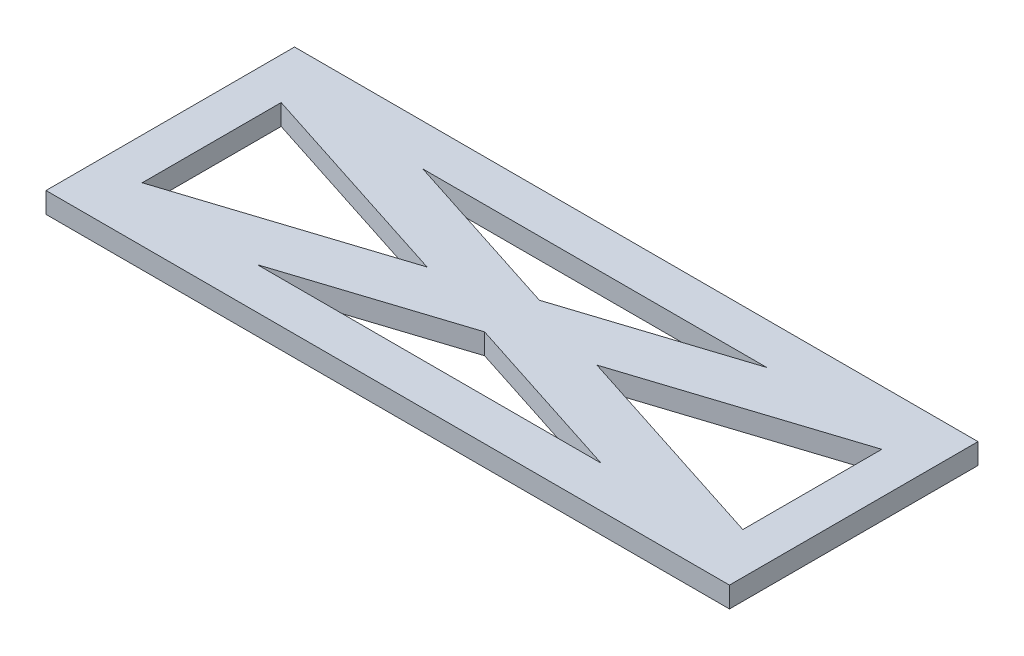
ISO-10303-21;
HEADER;
FILE_DESCRIPTION(('STEP AP214'),'2;1');
FILE_NAME('part.step','',(''),(''),'','','');
FILE_SCHEMA(('AUTOMOTIVE_DESIGN { 1 0 10303 214 1 1 1 1 }'));
ENDSEC;
DATA;
#1=APPLICATION_CONTEXT('core data for automotive mechanical design processes');
#2=APPLICATION_PROTOCOL_DEFINITION('international standard','automotive_design',2000,#1);
#3=PRODUCT_CONTEXT('',#1,'mechanical');
#4=PRODUCT('Part','Part','',(#3));
#5=PRODUCT_RELATED_PRODUCT_CATEGORY('part','',(#4));
#6=PRODUCT_DEFINITION_FORMATION('','',#4);
#7=PRODUCT_DEFINITION_CONTEXT('part definition',#1,'design');
#8=PRODUCT_DEFINITION('design','',#6,#7);
#9=PRODUCT_DEFINITION_SHAPE('','',#8);
#10=(LENGTH_UNIT() NAMED_UNIT(*) SI_UNIT(.MILLI.,.METRE.));
#11=(NAMED_UNIT(*) PLANE_ANGLE_UNIT() SI_UNIT($,.RADIAN.));
#12=(NAMED_UNIT(*) SI_UNIT($,.STERADIAN.) SOLID_ANGLE_UNIT());
#13=UNCERTAINTY_MEASURE_WITH_UNIT(LENGTH_MEASURE(1.E-05),#10,'distance_accuracy_value','');
#14=(GEOMETRIC_REPRESENTATION_CONTEXT(3) GLOBAL_UNCERTAINTY_ASSIGNED_CONTEXT((#13)) GLOBAL_UNIT_ASSIGNED_CONTEXT((#10,
#11,#12)) REPRESENTATION_CONTEXT('',''));
#15=CARTESIAN_POINT('',(0.,0.,0.));
#16=DIRECTION('',(0.,0.,1.));
#17=DIRECTION('',(1.,0.,0.));
#18=AXIS2_PLACEMENT_3D('',#15,#16,#17);
#19=CARTESIAN_POINT('',(1.93213949104616,5.,5.98963242224309));
#20=DIRECTION('',(0.307002779922758,0.,0.951708617760551));
#21=DIRECTION('',(0.951708617760551,0.,-0.307002779922758));
#22=AXIS2_PLACEMENT_3D('',#19,#20,#21);
#23=PLANE('',#22);
#24=DIRECTION('',(-0.951708617760551,0.,0.307002779922758));
#25=VECTOR('',#24,1.);
#26=CARTESIAN_POINT('',(1.93213949104616,0.,5.98963242224309));
#27=LINE('',#26,#25);
#28=CARTESIAN_POINT('',(72.5,0.,-16.7741935483872));
#29=VERTEX_POINT('',#28);
#30=CARTESIAN_POINT('',(20.4999999999998,0.,0.));
#31=VERTEX_POINT('',#30);
#32=EDGE_CURVE('E164',#29,#31,#27,.T.);
#33=ORIENTED_EDGE('',*,*,#32,.F.);
#34=DIRECTION('',(0.,-1.,0.));
#35=VECTOR('',#34,1.);
#36=CARTESIAN_POINT('',(72.5,5.,-16.7741935483872));
#37=LINE('',#36,#35);
#38=CARTESIAN_POINT('',(72.5,5.,-16.7741935483872));
#39=VERTEX_POINT('',#38);
#40=EDGE_CURVE('E11',#39,#29,#37,.T.);
#41=ORIENTED_EDGE('',*,*,#40,.F.);
#42=DIRECTION('',(-0.951708617760551,0.,0.307002779922758));
#43=VECTOR('',#42,1.);
#44=CARTESIAN_POINT('',(1.93213949104616,5.,5.98963242224309));
#45=LINE('',#44,#43);
#46=CARTESIAN_POINT('',(20.4999999999998,5.,0.));
#47=VERTEX_POINT('',#46);
#48=EDGE_CURVE('E163',#39,#47,#45,.T.);
#49=ORIENTED_EDGE('',*,*,#48,.T.);
#50=DIRECTION('',(0.,-1.,0.));
#51=VECTOR('',#50,1.);
#52=CARTESIAN_POINT('',(20.4999999999998,5.,0.));
#53=LINE('',#52,#51);
#54=EDGE_CURVE('E118',#47,#31,#53,.T.);
#55=ORIENTED_EDGE('',*,*,#54,.T.);
#56=EDGE_LOOP('',(#33,#41,#49,#55));
#57=FACE_BOUND('',#56,.T.);
#58=ADVANCED_FACE('F40',(#57),#23,.T.);
#59=CARTESIAN_POINT('',(72.5,5.,0.));
#60=DIRECTION('',(1.,0.,0.));
#61=DIRECTION('',(0.,0.,-1.));
#62=AXIS2_PLACEMENT_3D('',#59,#60,#61);
#63=PLANE('',#62);
#64=DIRECTION('',(0.,0.,1.));
#65=VECTOR('',#64,1.);
#66=CARTESIAN_POINT('',(72.5,0.,0.));
#67=LINE('',#66,#65);
#68=CARTESIAN_POINT('',(72.5,0.,16.7741935483871));
#69=VERTEX_POINT('',#68);
#70=EDGE_CURVE('E217',#29,#69,#67,.T.);
#71=ORIENTED_EDGE('',*,*,#70,.T.);
#72=DIRECTION('',(0.,-1.,0.));
#73=VECTOR('',#72,1.);
#74=CARTESIAN_POINT('',(72.5,5.,16.7741935483871));
#75=LINE('',#74,#73);
#76=CARTESIAN_POINT('',(72.5,5.,16.7741935483871));
#77=VERTEX_POINT('',#76);
#78=EDGE_CURVE('E50',#77,#69,#75,.T.);
#79=ORIENTED_EDGE('',*,*,#78,.F.);
#80=DIRECTION('',(0.,0.,1.));
#81=VECTOR('',#80,1.);
#82=CARTESIAN_POINT('',(72.5,5.,0.));
#83=LINE('',#82,#81);
#84=EDGE_CURVE('E168',#39,#77,#83,.T.);
#85=ORIENTED_EDGE('',*,*,#84,.F.);
#86=ORIENTED_EDGE('',*,*,#40,.T.);
#87=EDGE_LOOP('',(#71,#79,#85,#86));
#88=FACE_BOUND('',#87,.T.);
#89=ADVANCED_FACE('F169',(#88),#63,.F.);
#90=CARTESIAN_POINT('',(82.5,5.,0.));
#91=DIRECTION('',(-1.,0.,0.));
#92=DIRECTION('',(0.,0.,1.));
#93=AXIS2_PLACEMENT_3D('',#90,#91,#92);
#94=PLANE('',#93);
#95=DIRECTION('',(0.,0.,-1.));
#96=VECTOR('',#95,1.);
#97=CARTESIAN_POINT('',(82.5,0.,0.));
#98=LINE('',#97,#96);
#99=CARTESIAN_POINT('',(82.5,0.,30.));
#100=VERTEX_POINT('',#99);
#101=CARTESIAN_POINT('',(82.5,0.,-30.));
#102=VERTEX_POINT('',#101);
#103=EDGE_CURVE('E207',#100,#102,#98,.T.);
#104=ORIENTED_EDGE('',*,*,#103,.T.);
#105=DIRECTION('',(0.,-1.,0.));
#106=VECTOR('',#105,1.);
#107=CARTESIAN_POINT('',(82.5,5.,-30.));
#108=LINE('',#107,#106);
#109=CARTESIAN_POINT('',(82.5,5.,-30.));
#110=VERTEX_POINT('',#109);
#111=EDGE_CURVE('E222',#110,#102,#108,.T.);
#112=ORIENTED_EDGE('',*,*,#111,.F.);
#113=DIRECTION('',(0.,0.,-1.));
#114=VECTOR('',#113,1.);
#115=CARTESIAN_POINT('',(82.5,5.,0.));
#116=LINE('',#115,#114);
#117=CARTESIAN_POINT('',(82.5,5.,30.));
#118=VERTEX_POINT('',#117);
#119=EDGE_CURVE('E286',#118,#110,#116,.T.);
#120=ORIENTED_EDGE('',*,*,#119,.F.);
#121=DIRECTION('',(0.,-1.,0.));
#122=VECTOR('',#121,1.);
#123=CARTESIAN_POINT('',(82.5,5.,30.));
#124=LINE('',#123,#122);
#125=EDGE_CURVE('E224',#118,#100,#124,.T.);
#126=ORIENTED_EDGE('',*,*,#125,.T.);
#127=EDGE_LOOP('',(#104,#112,#120,#126));
#128=FACE_BOUND('',#127,.T.);
#129=ADVANCED_FACE('F306',(#128),#94,.F.);
#130=CARTESIAN_POINT('',(0.,5.,-30.));
#131=DIRECTION('',(0.,0.,1.));
#132=DIRECTION('',(1.,0.,0.));
#133=AXIS2_PLACEMENT_3D('',#130,#131,#132);
#134=PLANE('',#133);
#135=DIRECTION('',(-1.,0.,0.));
#136=VECTOR('',#135,1.);
#137=CARTESIAN_POINT('',(0.,0.,-30.));
#138=LINE('',#137,#136);
#139=CARTESIAN_POINT('',(-82.5,0.,-30.));
#140=VERTEX_POINT('',#139);
#141=EDGE_CURVE('E210',#102,#140,#138,.T.);
#142=ORIENTED_EDGE('',*,*,#141,.T.);
#143=DIRECTION('',(0.,-1.,0.));
#144=VECTOR('',#143,1.);
#145=CARTESIAN_POINT('',(-82.5,5.,-30.));
#146=LINE('',#145,#144);
#147=CARTESIAN_POINT('',(-82.5,5.,-30.));
#148=VERTEX_POINT('',#147);
#149=EDGE_CURVE('E231',#148,#140,#146,.T.);
#150=ORIENTED_EDGE('',*,*,#149,.F.);
#151=DIRECTION('',(-1.,0.,0.));
#152=VECTOR('',#151,1.);
#153=CARTESIAN_POINT('',(0.,5.,-30.));
#154=LINE('',#153,#152);
#155=EDGE_CURVE('E289',#110,#148,#154,.T.);
#156=ORIENTED_EDGE('',*,*,#155,.F.);
#157=ORIENTED_EDGE('',*,*,#111,.T.);
#158=EDGE_LOOP('',(#142,#150,#156,#157));
#159=FACE_BOUND('',#158,.T.);
#160=ADVANCED_FACE('F308',(#159),#134,.F.);
#161=CARTESIAN_POINT('',(-82.5,5.,0.));
#162=DIRECTION('',(1.,0.,0.));
#163=DIRECTION('',(0.,0.,-1.));
#164=AXIS2_PLACEMENT_3D('',#161,#162,#163);
#165=PLANE('',#164);
#166=DIRECTION('',(0.,0.,1.));
#167=VECTOR('',#166,1.);
#168=CARTESIAN_POINT('',(-82.5,0.,0.));
#169=LINE('',#168,#167);
#170=CARTESIAN_POINT('',(-82.5,0.,30.));
#171=VERTEX_POINT('',#170);
#172=EDGE_CURVE('E212',#140,#171,#169,.T.);
#173=ORIENTED_EDGE('',*,*,#172,.T.);
#174=DIRECTION('',(0.,-1.,0.));
#175=VECTOR('',#174,1.);
#176=CARTESIAN_POINT('',(-82.5,5.,30.));
#177=LINE('',#176,#175);
#178=CARTESIAN_POINT('',(-82.5,5.,30.));
#179=VERTEX_POINT('',#178);
#180=EDGE_CURVE('E227',#179,#171,#177,.T.);
#181=ORIENTED_EDGE('',*,*,#180,.F.);
#182=DIRECTION('',(0.,0.,1.));
#183=VECTOR('',#182,1.);
#184=CARTESIAN_POINT('',(-82.5,5.,0.));
#185=LINE('',#184,#183);
#186=EDGE_CURVE('E174',#148,#179,#185,.T.);
#187=ORIENTED_EDGE('',*,*,#186,.F.);
#188=ORIENTED_EDGE('',*,*,#149,.T.);
#189=EDGE_LOOP('',(#173,#181,#187,#188));
#190=FACE_BOUND('',#189,.T.);
#191=ADVANCED_FACE('F297',(#190),#165,.F.);
#192=CARTESIAN_POINT('',(-72.5,5.,0.));
#193=DIRECTION('',(1.,0.,0.));
#194=DIRECTION('',(0.,0.,-1.));
#195=AXIS2_PLACEMENT_3D('',#192,#193,#194);
#196=PLANE('',#195);
#197=DIRECTION('',(0.,0.,1.));
#198=VECTOR('',#197,1.);
#199=CARTESIAN_POINT('',(-72.5,0.,0.));
#200=LINE('',#199,#198);
#201=CARTESIAN_POINT('',(-72.5,0.,-16.7741935483871));
#202=VERTEX_POINT('',#201);
#203=CARTESIAN_POINT('',(-72.5000000000001,0.,16.7741935483871));
#204=VERTEX_POINT('',#203);
#205=EDGE_CURVE('E198',#202,#204,#200,.T.);
#206=ORIENTED_EDGE('',*,*,#205,.F.);
#207=DIRECTION('',(0.,-1.,0.));
#208=VECTOR('',#207,1.);
#209=CARTESIAN_POINT('',(-72.5,5.,-16.7741935483871));
#210=LINE('',#209,#208);
#211=CARTESIAN_POINT('',(-72.5,5.,-16.7741935483871));
#212=VERTEX_POINT('',#211);
#213=EDGE_CURVE('E228',#212,#202,#210,.T.);
#214=ORIENTED_EDGE('',*,*,#213,.F.);
#215=DIRECTION('',(0.,0.,1.));
#216=VECTOR('',#215,1.);
#217=CARTESIAN_POINT('',(-72.5,5.,0.));
#218=LINE('',#217,#216);
#219=CARTESIAN_POINT('',(-72.5000000000001,5.,16.7741935483871));
#220=VERTEX_POINT('',#219);
#221=EDGE_CURVE('E278',#212,#220,#218,.T.);
#222=ORIENTED_EDGE('',*,*,#221,.T.);
#223=DIRECTION('',(0.,-1.,0.));
#224=VECTOR('',#223,1.);
#225=CARTESIAN_POINT('',(-72.5000000000001,5.,16.7741935483871));
#226=LINE('',#225,#224);
#227=EDGE_CURVE('E236',#220,#204,#226,.T.);
#228=ORIENTED_EDGE('',*,*,#227,.T.);
#229=EDGE_LOOP('',(#206,#214,#222,#228));
#230=FACE_BOUND('',#229,.T.);
#231=ADVANCED_FACE('F330',(#230),#196,.T.);
#232=CARTESIAN_POINT('',(-1.93213949104618,5.,5.98963242224316));
#233=DIRECTION('',(0.307002779922758,0.,-0.951708617760551));
#234=DIRECTION('',(-0.951708617760551,0.,-0.307002779922758));
#235=AXIS2_PLACEMENT_3D('',#232,#233,#234);
#236=PLANE('',#235);
#237=DIRECTION('',(0.951708617760551,0.,0.307002779922758));
#238=VECTOR('',#237,1.);
#239=CARTESIAN_POINT('',(-1.93213949104618,0.,5.98963242224316));
#240=LINE('',#239,#238);
#241=CARTESIAN_POINT('',(-20.5,0.,0.));
#242=VERTEX_POINT('',#241);
#243=EDGE_CURVE('E201',#202,#242,#240,.T.);
#244=ORIENTED_EDGE('',*,*,#243,.T.);
#245=DIRECTION('',(0.,-1.,0.));
#246=VECTOR('',#245,1.);
#247=CARTESIAN_POINT('',(-20.5,5.,0.));
#248=LINE('',#247,#246);
#249=CARTESIAN_POINT('',(-20.5,5.,0.));
#250=VERTEX_POINT('',#249);
#251=EDGE_CURVE('E238',#250,#242,#248,.T.);
#252=ORIENTED_EDGE('',*,*,#251,.F.);
#253=DIRECTION('',(0.951708617760551,0.,0.307002779922758));
#254=VECTOR('',#253,1.);
#255=CARTESIAN_POINT('',(-1.93213949104618,5.,5.98963242224316));
#256=LINE('',#255,#254);
#257=EDGE_CURVE('E281',#212,#250,#256,.T.);
#258=ORIENTED_EDGE('',*,*,#257,.F.);
#259=ORIENTED_EDGE('',*,*,#213,.T.);
#260=EDGE_LOOP('',(#244,#252,#258,#259));
#261=FACE_BOUND('',#260,.T.);
#262=ADVANCED_FACE('F339',(#261),#236,.F.);
#263=CARTESIAN_POINT('',(0.,5.,19.9999998983871));
#264=DIRECTION('',(0.,0.,-1.));
#265=DIRECTION('',(-1.,0.,0.));
#266=AXIS2_PLACEMENT_3D('',#263,#264,#265);
#267=PLANE('',#266);
#268=DIRECTION('',(1.,0.,0.));
#269=VECTOR('',#268,1.);
#270=CARTESIAN_POINT('',(0.,0.,19.9999998983871));
#271=LINE('',#270,#269);
#272=CARTESIAN_POINT('',(-41.5,0.,19.9999998983871));
#273=VERTEX_POINT('',#272);
#274=CARTESIAN_POINT('',(41.5000000000002,0.,19.9999998983871));
#275=VERTEX_POINT('',#274);
#276=EDGE_CURVE('E189',#273,#275,#271,.T.);
#277=ORIENTED_EDGE('',*,*,#276,.F.);
#278=DIRECTION('',(0.,-1.,0.));
#279=VECTOR('',#278,1.);
#280=CARTESIAN_POINT('',(-41.5,5.,19.9999998983871));
#281=LINE('',#280,#279);
#282=CARTESIAN_POINT('',(-41.5,5.,19.9999998983871));
#283=VERTEX_POINT('',#282);
#284=EDGE_CURVE('E239',#283,#273,#281,.T.);
#285=ORIENTED_EDGE('',*,*,#284,.F.);
#286=DIRECTION('',(1.,0.,0.));
#287=VECTOR('',#286,1.);
#288=CARTESIAN_POINT('',(0.,5.,19.9999998983871));
#289=LINE('',#288,#287);
#290=CARTESIAN_POINT('',(41.5000000000002,5.,19.9999998983871));
#291=VERTEX_POINT('',#290);
#292=EDGE_CURVE('E267',#283,#291,#289,.T.);
#293=ORIENTED_EDGE('',*,*,#292,.T.);
#294=DIRECTION('',(0.,-1.,0.));
#295=VECTOR('',#294,1.);
#296=CARTESIAN_POINT('',(41.5000000000002,5.,19.9999998983871));
#297=LINE('',#296,#295);
#298=EDGE_CURVE('E242',#291,#275,#297,.T.);
#299=ORIENTED_EDGE('',*,*,#298,.T.);
#300=EDGE_LOOP('',(#277,#285,#293,#299));
#301=FACE_BOUND('',#300,.T.);
#302=ADVANCED_FACE('F342',(#301),#267,.T.);
#303=CARTESIAN_POINT('',(1.9321394613572,5.,5.98963233020732));
#304=DIRECTION('',(-0.307002779922759,0.,-0.951708617760551));
#305=DIRECTION('',(-0.951708617760551,0.,0.307002779922759));
#306=AXIS2_PLACEMENT_3D('',#303,#304,#305);
#307=PLANE('',#306);
#308=DIRECTION('',(0.951708617760551,0.,-0.307002779922759));
#309=VECTOR('',#308,1.);
#310=CARTESIAN_POINT('',(1.9321394613572,0.,5.98963233020732));
#311=LINE('',#310,#309);
#312=CARTESIAN_POINT('',(0.,0.,6.61290312419352));
#313=VERTEX_POINT('',#312);
#314=EDGE_CURVE('E192',#273,#313,#311,.T.);
#315=ORIENTED_EDGE('',*,*,#314,.T.);
#316=DIRECTION('',(0.,-1.,0.));
#317=VECTOR('',#316,1.);
#318=CARTESIAN_POINT('',(0.,5.,6.61290312419352));
#319=LINE('',#318,#317);
#320=CARTESIAN_POINT('',(0.,5.,6.61290312419352));
#321=VERTEX_POINT('',#320);
#322=EDGE_CURVE('E244',#321,#313,#319,.T.);
#323=ORIENTED_EDGE('',*,*,#322,.F.);
#324=DIRECTION('',(0.951708617760551,0.,-0.307002779922759));
#325=VECTOR('',#324,1.);
#326=CARTESIAN_POINT('',(1.9321394613572,5.,5.98963233020732));
#327=LINE('',#326,#325);
#328=EDGE_CURVE('E270',#283,#321,#327,.T.);
#329=ORIENTED_EDGE('',*,*,#328,.F.);
#330=ORIENTED_EDGE('',*,*,#284,.T.);
#331=EDGE_LOOP('',(#315,#323,#329,#330));
#332=FACE_BOUND('',#331,.T.);
#333=ADVANCED_FACE('F350',(#332),#307,.F.);
#334=CARTESIAN_POINT('',(0.,5.,-19.9999998983871));
#335=DIRECTION('',(0.,0.,1.));
#336=DIRECTION('',(1.,0.,0.));
#337=AXIS2_PLACEMENT_3D('',#334,#335,#336);
#338=PLANE('',#337);
#339=DIRECTION('',(-1.,0.,0.));
#340=VECTOR('',#339,1.);
#341=CARTESIAN_POINT('',(0.,0.,-19.9999998983871));
#342=LINE('',#341,#340);
#343=CARTESIAN_POINT('',(41.5000000000002,0.,-19.9999998983871));
#344=VERTEX_POINT('',#343);
#345=CARTESIAN_POINT('',(-41.5,0.,-19.9999998983871));
#346=VERTEX_POINT('',#345);
#347=EDGE_CURVE('E180',#344,#346,#342,.T.);
#348=ORIENTED_EDGE('',*,*,#347,.F.);
#349=DIRECTION('',(0.,-1.,0.));
#350=VECTOR('',#349,1.);
#351=CARTESIAN_POINT('',(41.5000000000002,5.,-19.9999998983871));
#352=LINE('',#351,#350);
#353=CARTESIAN_POINT('',(41.5000000000002,5.,-19.9999998983871));
#354=VERTEX_POINT('',#353);
#355=EDGE_CURVE('E44',#354,#344,#352,.T.);
#356=ORIENTED_EDGE('',*,*,#355,.F.);
#357=DIRECTION('',(-1.,0.,0.));
#358=VECTOR('',#357,1.);
#359=CARTESIAN_POINT('',(0.,5.,-19.9999998983871));
#360=LINE('',#359,#358);
#361=CARTESIAN_POINT('',(-41.5,5.,-19.9999998983871));
#362=VERTEX_POINT('',#361);
#363=EDGE_CURVE('E220',#354,#362,#360,.T.);
#364=ORIENTED_EDGE('',*,*,#363,.T.);
#365=DIRECTION('',(0.,-1.,0.));
#366=VECTOR('',#365,1.);
#367=CARTESIAN_POINT('',(-41.5,5.,-19.9999998983871));
#368=LINE('',#367,#366);
#369=EDGE_CURVE('E179',#362,#346,#368,.T.);
#370=ORIENTED_EDGE('',*,*,#369,.T.);
#371=EDGE_LOOP('',(#348,#356,#364,#370));
#372=FACE_BOUND('',#371,.T.);
#373=ADVANCED_FACE('F42',(#372),#338,.T.);
#374=CARTESIAN_POINT('',(-1.93213946135721,5.,-5.98963233020734));
#375=DIRECTION('',(-0.307002779922758,0.,-0.951708617760551));
#376=DIRECTION('',(-0.951708617760551,0.,0.307002779922758));
#377=AXIS2_PLACEMENT_3D('',#374,#375,#376);
#378=PLANE('',#377);
#379=DIRECTION('',(0.951708617760551,0.,-0.307002779922758));
#380=VECTOR('',#379,1.);
#381=CARTESIAN_POINT('',(-1.93213946135721,0.,-5.98963233020734));
#382=LINE('',#381,#380);
#383=CARTESIAN_POINT('',(0.,0.,-6.61290312419353));
#384=VERTEX_POINT('',#383);
#385=EDGE_CURVE('E183',#384,#344,#382,.T.);
#386=ORIENTED_EDGE('',*,*,#385,.F.);
#387=DIRECTION('',(0.,-1.,0.));
#388=VECTOR('',#387,1.);
#389=CARTESIAN_POINT('',(0.,5.,-6.61290312419353));
#390=LINE('',#389,#388);
#391=CARTESIAN_POINT('',(0.,5.,-6.61290312419353));
#392=VERTEX_POINT('',#391);
#393=EDGE_CURVE('E248',#392,#384,#390,.T.);
#394=ORIENTED_EDGE('',*,*,#393,.F.);
#395=DIRECTION('',(0.951708617760551,0.,-0.307002779922758));
#396=VECTOR('',#395,1.);
#397=CARTESIAN_POINT('',(-1.93213946135721,5.,-5.98963233020734));
#398=LINE('',#397,#396);
#399=EDGE_CURVE('E257',#392,#354,#398,.T.);
#400=ORIENTED_EDGE('',*,*,#399,.T.);
#401=ORIENTED_EDGE('',*,*,#355,.T.);
#402=EDGE_LOOP('',(#386,#394,#400,#401));
#403=FACE_BOUND('',#402,.T.);
#404=ADVANCED_FACE('F255',(#403),#378,.T.);
#405=CARTESIAN_POINT('',(0.,5.,30.));
#406=DIRECTION('',(0.,0.,-1.));
#407=DIRECTION('',(-1.,0.,0.));
#408=AXIS2_PLACEMENT_3D('',#405,#406,#407);
#409=PLANE('',#408);
#410=DIRECTION('',(1.,0.,0.));
#411=VECTOR('',#410,1.);
#412=CARTESIAN_POINT('',(0.,0.,30.));
#413=LINE('',#412,#411);
#414=EDGE_CURVE('E214',#171,#100,#413,.T.);
#415=ORIENTED_EDGE('',*,*,#414,.T.);
#416=ORIENTED_EDGE('',*,*,#125,.F.);
#417=DIRECTION('',(1.,0.,0.));
#418=VECTOR('',#417,1.);
#419=CARTESIAN_POINT('',(0.,5.,30.));
#420=LINE('',#419,#418);
#421=EDGE_CURVE('E172',#179,#118,#420,.T.);
#422=ORIENTED_EDGE('',*,*,#421,.F.);
#423=ORIENTED_EDGE('',*,*,#180,.T.);
#424=EDGE_LOOP('',(#415,#416,#422,#423));
#425=FACE_BOUND('',#424,.T.);
#426=ADVANCED_FACE('F301',(#425),#409,.F.);
#427=CARTESIAN_POINT('',(-1.93213949104619,5.,-5.98963242224317));
#428=DIRECTION('',(-0.307002779922759,0.,-0.951708617760551));
#429=DIRECTION('',(-0.951708617760551,0.,0.307002779922759));
#430=AXIS2_PLACEMENT_3D('',#427,#428,#429);
#431=PLANE('',#430);
#432=DIRECTION('',(0.951708617760551,0.,-0.307002779922759));
#433=VECTOR('',#432,1.);
#434=CARTESIAN_POINT('',(-1.93213949104619,0.,-5.98963242224317));
#435=LINE('',#434,#433);
#436=EDGE_CURVE('E204',#204,#242,#435,.T.);
#437=ORIENTED_EDGE('',*,*,#436,.F.);
#438=ORIENTED_EDGE('',*,*,#227,.F.);
#439=DIRECTION('',(0.951708617760551,0.,-0.307002779922759));
#440=VECTOR('',#439,1.);
#441=CARTESIAN_POINT('',(-1.93213949104619,5.,-5.98963242224317));
#442=LINE('',#441,#440);
#443=EDGE_CURVE('E283',#220,#250,#442,.T.);
#444=ORIENTED_EDGE('',*,*,#443,.T.);
#445=ORIENTED_EDGE('',*,*,#251,.T.);
#446=EDGE_LOOP('',(#437,#438,#444,#445));
#447=FACE_BOUND('',#446,.T.);
#448=ADVANCED_FACE('F327',(#447),#431,.T.);
#449=CARTESIAN_POINT('',(-1.9321394613572,5.,5.98963233020733));
#450=DIRECTION('',(0.307002779922758,0.,-0.951708617760551));
#451=DIRECTION('',(-0.951708617760551,0.,-0.307002779922758));
#452=AXIS2_PLACEMENT_3D('',#449,#450,#451);
#453=PLANE('',#452);
#454=DIRECTION('',(0.951708617760551,0.,0.307002779922758));
#455=VECTOR('',#454,1.);
#456=CARTESIAN_POINT('',(-1.9321394613572,0.,5.98963233020733));
#457=LINE('',#456,#455);
#458=EDGE_CURVE('E195',#313,#275,#457,.T.);
#459=ORIENTED_EDGE('',*,*,#458,.T.);
#460=ORIENTED_EDGE('',*,*,#298,.F.);
#461=DIRECTION('',(0.951708617760551,0.,0.307002779922758));
#462=VECTOR('',#461,1.);
#463=CARTESIAN_POINT('',(-1.9321394613572,5.,5.98963233020733));
#464=LINE('',#463,#462);
#465=EDGE_CURVE('E276',#321,#291,#464,.T.);
#466=ORIENTED_EDGE('',*,*,#465,.F.);
#467=ORIENTED_EDGE('',*,*,#322,.T.);
#468=EDGE_LOOP('',(#459,#460,#466,#467));
#469=FACE_BOUND('',#468,.T.);
#470=ADVANCED_FACE('F337',(#469),#453,.F.);
#471=CARTESIAN_POINT('',(1.9321394613572,5.,-5.98963233020733));
#472=DIRECTION('',(0.307002779922758,0.,-0.951708617760551));
#473=DIRECTION('',(-0.951708617760551,0.,-0.307002779922758));
#474=AXIS2_PLACEMENT_3D('',#471,#472,#473);
#475=PLANE('',#474);
#476=DIRECTION('',(0.951708617760551,0.,0.307002779922758));
#477=VECTOR('',#476,1.);
#478=CARTESIAN_POINT('',(1.9321394613572,0.,-5.98963233020733));
#479=LINE('',#478,#477);
#480=EDGE_CURVE('E186',#346,#384,#479,.T.);
#481=ORIENTED_EDGE('',*,*,#480,.F.);
#482=ORIENTED_EDGE('',*,*,#369,.F.);
#483=DIRECTION('',(0.951708617760551,0.,0.307002779922758));
#484=VECTOR('',#483,1.);
#485=CARTESIAN_POINT('',(1.9321394613572,5.,-5.98963233020733));
#486=LINE('',#485,#484);
#487=EDGE_CURVE('E263',#362,#392,#486,.T.);
#488=ORIENTED_EDGE('',*,*,#487,.T.);
#489=ORIENTED_EDGE('',*,*,#393,.T.);
#490=EDGE_LOOP('',(#481,#482,#488,#489));
#491=FACE_BOUND('',#490,.T.);
#492=ADVANCED_FACE('F261',(#491),#475,.T.);
#493=CARTESIAN_POINT('',(1.93213949104619,5.,-5.98963242224317));
#494=DIRECTION('',(-0.307002779922759,0.,0.951708617760551));
#495=DIRECTION('',(0.951708617760551,0.,0.307002779922759));
#496=AXIS2_PLACEMENT_3D('',#493,#494,#495);
#497=PLANE('',#496);
#498=DIRECTION('',(-0.951708617760551,0.,-0.307002779922759));
#499=VECTOR('',#498,1.);
#500=CARTESIAN_POINT('',(1.93213949104619,0.,-5.98963242224317));
#501=LINE('',#500,#499);
#502=EDGE_CURVE('E111',#69,#31,#501,.T.);
#503=ORIENTED_EDGE('',*,*,#502,.T.);
#504=ORIENTED_EDGE('',*,*,#54,.F.);
#505=DIRECTION('',(-0.951708617760551,0.,-0.307002779922759));
#506=VECTOR('',#505,1.);
#507=CARTESIAN_POINT('',(1.93213949104619,5.,-5.98963242224317));
#508=LINE('',#507,#506);
#509=EDGE_CURVE('E59',#77,#47,#508,.T.);
#510=ORIENTED_EDGE('',*,*,#509,.F.);
#511=ORIENTED_EDGE('',*,*,#78,.T.);
#512=EDGE_LOOP('',(#503,#504,#510,#511));
#513=FACE_BOUND('',#512,.T.);
#514=ADVANCED_FACE('F315',(#513),#497,.F.);
#515=CARTESIAN_POINT('',(0.,5.,0.));
#516=DIRECTION('',(0.,1.,0.));
#517=DIRECTION('',(0.,0.,1.));
#518=AXIS2_PLACEMENT_3D('',#515,#516,#517);
#519=PLANE('',#518);
#520=ORIENTED_EDGE('',*,*,#363,.F.);
#521=ORIENTED_EDGE('',*,*,#399,.F.);
#522=ORIENTED_EDGE('',*,*,#487,.F.);
#523=EDGE_LOOP('',(#520,#521,#522));
#524=FACE_BOUND('',#523,.T.);
#525=ORIENTED_EDGE('',*,*,#292,.F.);
#526=ORIENTED_EDGE('',*,*,#328,.T.);
#527=ORIENTED_EDGE('',*,*,#465,.T.);
#528=EDGE_LOOP('',(#525,#526,#527));
#529=FACE_BOUND('',#528,.T.);
#530=ORIENTED_EDGE('',*,*,#221,.F.);
#531=ORIENTED_EDGE('',*,*,#257,.T.);
#532=ORIENTED_EDGE('',*,*,#443,.F.);
#533=EDGE_LOOP('',(#530,#531,#532));
#534=FACE_BOUND('',#533,.T.);
#535=ORIENTED_EDGE('',*,*,#119,.T.);
#536=ORIENTED_EDGE('',*,*,#155,.T.);
#537=ORIENTED_EDGE('',*,*,#186,.T.);
#538=ORIENTED_EDGE('',*,*,#421,.T.);
#539=EDGE_LOOP('',(#535,#536,#537,#538));
#540=FACE_BOUND('',#539,.T.);
#541=ORIENTED_EDGE('',*,*,#48,.F.);
#542=ORIENTED_EDGE('',*,*,#84,.T.);
#543=ORIENTED_EDGE('',*,*,#509,.T.);
#544=EDGE_LOOP('',(#541,#542,#543));
#545=FACE_BOUND('',#544,.T.);
#546=ADVANCED_FACE('F171',(#524,#529,#534,#540,#545),#519,.T.);
#547=CARTESIAN_POINT('',(0.,0.,0.));
#548=DIRECTION('',(0.,1.,0.));
#549=DIRECTION('',(0.,0.,1.));
#550=AXIS2_PLACEMENT_3D('',#547,#548,#549);
#551=PLANE('',#550);
#552=ORIENTED_EDGE('',*,*,#347,.T.);
#553=ORIENTED_EDGE('',*,*,#480,.T.);
#554=ORIENTED_EDGE('',*,*,#385,.T.);
#555=EDGE_LOOP('',(#552,#553,#554));
#556=FACE_BOUND('',#555,.T.);
#557=ORIENTED_EDGE('',*,*,#276,.T.);
#558=ORIENTED_EDGE('',*,*,#458,.F.);
#559=ORIENTED_EDGE('',*,*,#314,.F.);
#560=EDGE_LOOP('',(#557,#558,#559));
#561=FACE_BOUND('',#560,.T.);
#562=ORIENTED_EDGE('',*,*,#205,.T.);
#563=ORIENTED_EDGE('',*,*,#436,.T.);
#564=ORIENTED_EDGE('',*,*,#243,.F.);
#565=EDGE_LOOP('',(#562,#563,#564));
#566=FACE_BOUND('',#565,.T.);
#567=ORIENTED_EDGE('',*,*,#103,.F.);
#568=ORIENTED_EDGE('',*,*,#414,.F.);
#569=ORIENTED_EDGE('',*,*,#172,.F.);
#570=ORIENTED_EDGE('',*,*,#141,.F.);
#571=EDGE_LOOP('',(#567,#568,#569,#570));
#572=FACE_BOUND('',#571,.T.);
#573=ORIENTED_EDGE('',*,*,#32,.T.);
#574=ORIENTED_EDGE('',*,*,#502,.F.);
#575=ORIENTED_EDGE('',*,*,#70,.F.);
#576=EDGE_LOOP('',(#573,#574,#575));
#577=FACE_BOUND('',#576,.T.);
#578=ADVANCED_FACE('F259',(#556,#561,#566,#572,#577),#551,.F.);
#579=CLOSED_SHELL('',(#58,#89,#129,#160,#191,#231,#262,#302,#333,#373,#404,#426,#448,#470,#492,
#514,#546,#578));
#580=MANIFOLD_SOLID_BREP('B2',#579);
#581=ADVANCED_BREP_SHAPE_REPRESENTATION('',(#18,#580),#14);
#582=SHAPE_DEFINITION_REPRESENTATION(#9,#581);
ENDSEC;
END-ISO-10303-21;
